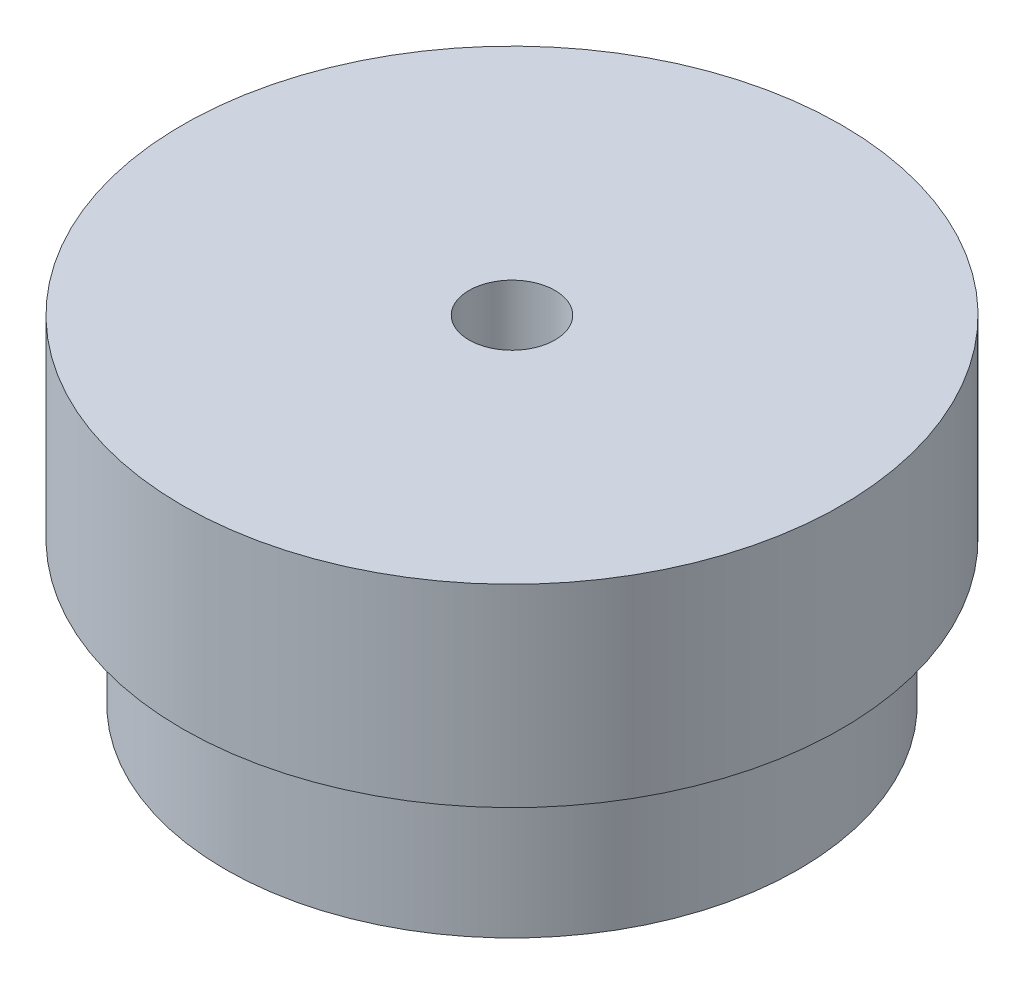
ISO-10303-21;
HEADER;
FILE_DESCRIPTION(('STEP AP214'),'2;1');
FILE_NAME('part.step','',(''),(''),'','','');
FILE_SCHEMA(('AUTOMOTIVE_DESIGN { 1 0 10303 214 1 1 1 1 }'));
ENDSEC;
DATA;
#1=APPLICATION_CONTEXT('core data for automotive mechanical design processes');
#2=APPLICATION_PROTOCOL_DEFINITION('international standard','automotive_design',2000,#1);
#3=PRODUCT_CONTEXT('',#1,'mechanical');
#4=PRODUCT('Part','Part','',(#3));
#5=PRODUCT_RELATED_PRODUCT_CATEGORY('part','',(#4));
#6=PRODUCT_DEFINITION_FORMATION('','',#4);
#7=PRODUCT_DEFINITION_CONTEXT('part definition',#1,'design');
#8=PRODUCT_DEFINITION('design','',#6,#7);
#9=PRODUCT_DEFINITION_SHAPE('','',#8);
#10=(LENGTH_UNIT() NAMED_UNIT(*) SI_UNIT(.MILLI.,.METRE.));
#11=(NAMED_UNIT(*) PLANE_ANGLE_UNIT() SI_UNIT($,.RADIAN.));
#12=(NAMED_UNIT(*) SI_UNIT($,.STERADIAN.) SOLID_ANGLE_UNIT());
#13=UNCERTAINTY_MEASURE_WITH_UNIT(LENGTH_MEASURE(1.E-05),#10,'distance_accuracy_value','');
#14=(GEOMETRIC_REPRESENTATION_CONTEXT(3) GLOBAL_UNCERTAINTY_ASSIGNED_CONTEXT((#13)) GLOBAL_UNIT_ASSIGNED_CONTEXT((#10,
#11,#12)) REPRESENTATION_CONTEXT('',''));
#15=CARTESIAN_POINT('',(0.,0.,0.));
#16=DIRECTION('',(0.,0.,1.));
#17=DIRECTION('',(1.,0.,0.));
#18=AXIS2_PLACEMENT_3D('',#15,#16,#17);
#19=CARTESIAN_POINT('',(0.,5.,-11.5));
#20=DIRECTION('',(0.,1.,0.));
#21=DIRECTION('',(0.,0.,1.));
#22=AXIS2_PLACEMENT_3D('',#19,#20,#21);
#23=PLANE('',#22);
#24=CARTESIAN_POINT('',(0.,5.,0.));
#25=DIRECTION('',(0.,-1.,0.));
#26=DIRECTION('',(0.,0.,-1.));
#27=AXIS2_PLACEMENT_3D('',#24,#25,#26);
#28=CIRCLE('',#27,1.5);
#29=CARTESIAN_POINT('',(0.,5.,-1.5));
#30=VERTEX_POINT('',#29);
#31=EDGE_CURVE('E10',#30,#30,#28,.T.);
#32=ORIENTED_EDGE('',*,*,#31,.T.);
#33=EDGE_LOOP('',(#32));
#34=FACE_BOUND('',#33,.T.);
#35=CARTESIAN_POINT('',(0.,5.,0.));
#36=DIRECTION('',(0.,-1.,0.));
#37=DIRECTION('',(0.,0.,-1.));
#38=AXIS2_PLACEMENT_3D('',#35,#36,#37);
#39=CIRCLE('',#38,11.5);
#40=CARTESIAN_POINT('',(0.,5.,-11.5));
#41=VERTEX_POINT('',#40);
#42=EDGE_CURVE('E43',#41,#41,#39,.T.);
#43=ORIENTED_EDGE('',*,*,#42,.F.);
#44=EDGE_LOOP('',(#43));
#45=FACE_BOUND('',#44,.T.);
#46=ADVANCED_FACE('F37',(#34,#45),#23,.T.);
#47=CARTESIAN_POINT('',(0.,0.,0.));
#48=DIRECTION('',(0.,-1.,0.));
#49=DIRECTION('',(0.,0.,-1.));
#50=AXIS2_PLACEMENT_3D('',#47,#48,#49);
#51=CYLINDRICAL_SURFACE('',#50,11.5);
#52=ORIENTED_EDGE('',*,*,#42,.T.);
#53=EDGE_LOOP('',(#52));
#54=FACE_BOUND('',#53,.T.);
#55=CARTESIAN_POINT('',(0.,-1.75,0.));
#56=DIRECTION('',(0.,-1.,0.));
#57=DIRECTION('',(0.,0.,-1.));
#58=AXIS2_PLACEMENT_3D('',#55,#56,#57);
#59=CIRCLE('',#58,11.5);
#60=CARTESIAN_POINT('',(0.,-1.75,-11.5));
#61=VERTEX_POINT('',#60);
#62=EDGE_CURVE('E48',#61,#61,#59,.T.);
#63=ORIENTED_EDGE('',*,*,#62,.F.);
#64=EDGE_LOOP('',(#63));
#65=FACE_BOUND('',#64,.T.);
#66=ADVANCED_FACE('F89',(#54,#65),#51,.T.);
#67=CARTESIAN_POINT('',(0.,-1.75,-11.5));
#68=DIRECTION('',(0.,-1.,0.));
#69=DIRECTION('',(0.,0.,-1.));
#70=AXIS2_PLACEMENT_3D('',#67,#68,#69);
#71=PLANE('',#70);
#72=ORIENTED_EDGE('',*,*,#62,.T.);
#73=EDGE_LOOP('',(#72));
#74=FACE_BOUND('',#73,.T.);
#75=CARTESIAN_POINT('',(0.,-1.75,0.));
#76=DIRECTION('',(0.,-1.,0.));
#77=DIRECTION('',(0.,0.,-1.));
#78=AXIS2_PLACEMENT_3D('',#75,#76,#77);
#79=CIRCLE('',#78,10.);
#80=CARTESIAN_POINT('',(0.,-1.75,-10.));
#81=VERTEX_POINT('',#80);
#82=EDGE_CURVE('E54',#81,#81,#79,.T.);
#83=ORIENTED_EDGE('',*,*,#82,.F.);
#84=EDGE_LOOP('',(#83));
#85=FACE_BOUND('',#84,.T.);
#86=ADVANCED_FACE('F93',(#74,#85),#71,.T.);
#87=CARTESIAN_POINT('',(0.,0.,0.));
#88=DIRECTION('',(0.,-1.,0.));
#89=DIRECTION('',(0.,0.,-1.));
#90=AXIS2_PLACEMENT_3D('',#87,#88,#89);
#91=CYLINDRICAL_SURFACE('',#90,10.);
#92=ORIENTED_EDGE('',*,*,#82,.T.);
#93=EDGE_LOOP('',(#92));
#94=FACE_BOUND('',#93,.T.);
#95=CARTESIAN_POINT('',(0.,-6.75,0.));
#96=DIRECTION('',(0.,-1.,0.));
#97=DIRECTION('',(0.,0.,-1.));
#98=AXIS2_PLACEMENT_3D('',#95,#96,#97);
#99=CIRCLE('',#98,10.);
#100=CARTESIAN_POINT('',(0.,-6.75,-10.));
#101=VERTEX_POINT('',#100);
#102=EDGE_CURVE('E59',#101,#101,#99,.T.);
#103=ORIENTED_EDGE('',*,*,#102,.F.);
#104=EDGE_LOOP('',(#103));
#105=FACE_BOUND('',#104,.T.);
#106=ADVANCED_FACE('F98',(#94,#105),#91,.T.);
#107=CARTESIAN_POINT('',(0.,-6.75,-10.));
#108=DIRECTION('',(0.,-1.,0.));
#109=DIRECTION('',(0.,0.,-1.));
#110=AXIS2_PLACEMENT_3D('',#107,#108,#109);
#111=PLANE('',#110);
#112=ORIENTED_EDGE('',*,*,#102,.T.);
#113=EDGE_LOOP('',(#112));
#114=FACE_BOUND('',#113,.T.);
#115=CARTESIAN_POINT('',(0.,-6.75,0.));
#116=DIRECTION('',(0.,-1.,0.));
#117=DIRECTION('',(0.,0.,-1.));
#118=AXIS2_PLACEMENT_3D('',#115,#116,#117);
#119=CIRCLE('',#118,7.5);
#120=CARTESIAN_POINT('',(0.,-6.75,-7.5));
#121=VERTEX_POINT('',#120);
#122=EDGE_CURVE('E62',#121,#121,#119,.T.);
#123=ORIENTED_EDGE('',*,*,#122,.F.);
#124=EDGE_LOOP('',(#123));
#125=FACE_BOUND('',#124,.T.);
#126=ADVANCED_FACE('F85',(#114,#125),#111,.T.);
#127=CARTESIAN_POINT('',(0.,0.,0.));
#128=DIRECTION('',(0.,-1.,0.));
#129=DIRECTION('',(0.,0.,-1.));
#130=AXIS2_PLACEMENT_3D('',#127,#128,#129);
#131=CYLINDRICAL_SURFACE('',#130,7.5);
#132=ORIENTED_EDGE('',*,*,#122,.T.);
#133=EDGE_LOOP('',(#132));
#134=FACE_BOUND('',#133,.T.);
#135=CARTESIAN_POINT('',(0.,-8.25,0.));
#136=DIRECTION('',(0.,-1.,0.));
#137=DIRECTION('',(0.,0.,-1.));
#138=AXIS2_PLACEMENT_3D('',#135,#136,#137);
#139=CIRCLE('',#138,7.5);
#140=CARTESIAN_POINT('',(0.,-8.25,-7.5));
#141=VERTEX_POINT('',#140);
#142=EDGE_CURVE('E65',#141,#141,#139,.T.);
#143=ORIENTED_EDGE('',*,*,#142,.F.);
#144=EDGE_LOOP('',(#143));
#145=FACE_BOUND('',#144,.T.);
#146=ADVANCED_FACE('F77',(#134,#145),#131,.T.);
#147=CARTESIAN_POINT('',(0.,-8.25,-7.5));
#148=DIRECTION('',(0.,-1.,0.));
#149=DIRECTION('',(0.,0.,-1.));
#150=AXIS2_PLACEMENT_3D('',#147,#148,#149);
#151=PLANE('',#150);
#152=ORIENTED_EDGE('',*,*,#142,.T.);
#153=EDGE_LOOP('',(#152));
#154=FACE_BOUND('',#153,.T.);
#155=CARTESIAN_POINT('',(0.,-8.25,0.));
#156=DIRECTION('',(0.,-1.,0.));
#157=DIRECTION('',(0.,0.,-1.));
#158=AXIS2_PLACEMENT_3D('',#155,#156,#157);
#159=CIRCLE('',#158,1.5);
#160=CARTESIAN_POINT('',(0.,-8.25,-1.5));
#161=VERTEX_POINT('',#160);
#162=EDGE_CURVE('E68',#161,#161,#159,.T.);
#163=ORIENTED_EDGE('',*,*,#162,.F.);
#164=EDGE_LOOP('',(#163));
#165=FACE_BOUND('',#164,.T.);
#166=ADVANCED_FACE('F75',(#154,#165),#151,.T.);
#167=CARTESIAN_POINT('',(0.,0.,0.));
#168=DIRECTION('',(0.,-1.,0.));
#169=DIRECTION('',(0.,0.,-1.));
#170=AXIS2_PLACEMENT_3D('',#167,#168,#169);
#171=CYLINDRICAL_SURFACE('',#170,1.5);
#172=ORIENTED_EDGE('',*,*,#162,.T.);
#173=EDGE_LOOP('',(#172));
#174=FACE_BOUND('',#173,.T.);
#175=ORIENTED_EDGE('',*,*,#31,.F.);
#176=EDGE_LOOP('',(#175));
#177=FACE_BOUND('',#176,.T.);
#178=ADVANCED_FACE('F72',(#174,#177),#171,.F.);
#179=CLOSED_SHELL('',(#46,#66,#86,#106,#126,#146,#166,#178));
#180=MANIFOLD_SOLID_BREP('B2',#179);
#181=ADVANCED_BREP_SHAPE_REPRESENTATION('',(#18,#180),#14);
#182=SHAPE_DEFINITION_REPRESENTATION(#9,#181);
ENDSEC;
END-ISO-10303-21;
